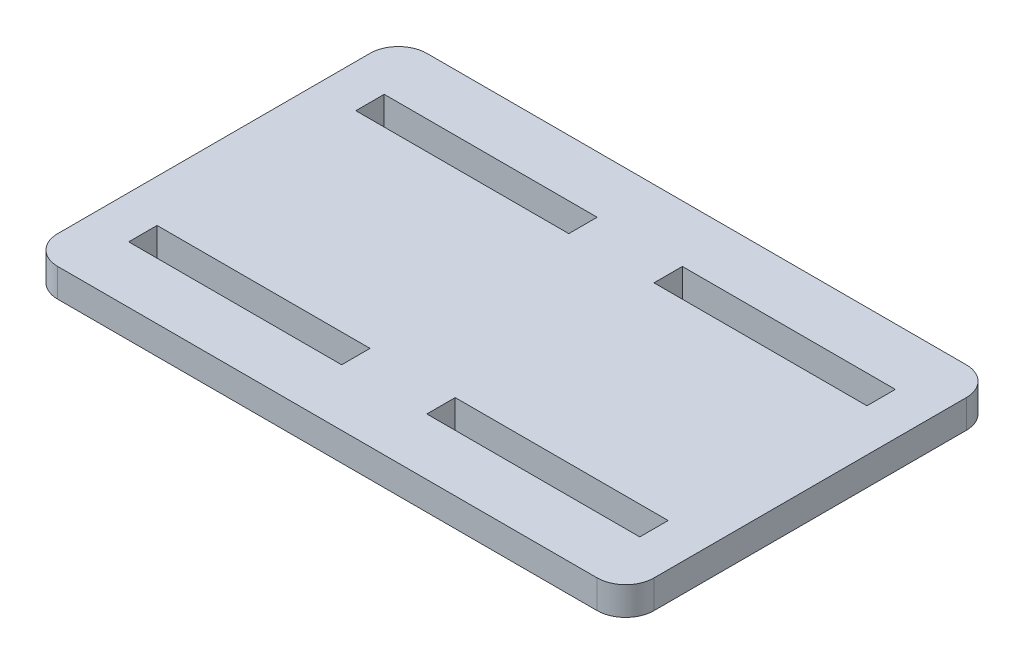
ISO-10303-21;
HEADER;
FILE_DESCRIPTION(('STEP AP214'),'2;1');
FILE_NAME('part.step','',(''),(''),'','','');
FILE_SCHEMA(('AUTOMOTIVE_DESIGN { 1 0 10303 214 1 1 1 1 }'));
ENDSEC;
DATA;
#1=APPLICATION_CONTEXT('core data for automotive mechanical design processes');
#2=APPLICATION_PROTOCOL_DEFINITION('international standard','automotive_design',2000,#1);
#3=PRODUCT_CONTEXT('',#1,'mechanical');
#4=PRODUCT('Part','Part','',(#3));
#5=PRODUCT_RELATED_PRODUCT_CATEGORY('part','',(#4));
#6=PRODUCT_DEFINITION_FORMATION('','',#4);
#7=PRODUCT_DEFINITION_CONTEXT('part definition',#1,'design');
#8=PRODUCT_DEFINITION('design','',#6,#7);
#9=PRODUCT_DEFINITION_SHAPE('','',#8);
#10=(LENGTH_UNIT() NAMED_UNIT(*) SI_UNIT(.MILLI.,.METRE.));
#11=(NAMED_UNIT(*) PLANE_ANGLE_UNIT() SI_UNIT($,.RADIAN.));
#12=(NAMED_UNIT(*) SI_UNIT($,.STERADIAN.) SOLID_ANGLE_UNIT());
#13=UNCERTAINTY_MEASURE_WITH_UNIT(LENGTH_MEASURE(1.E-05),#10,'distance_accuracy_value','');
#14=(GEOMETRIC_REPRESENTATION_CONTEXT(3) GLOBAL_UNCERTAINTY_ASSIGNED_CONTEXT((#13)) GLOBAL_UNIT_ASSIGNED_CONTEXT((#10,
#11,#12)) REPRESENTATION_CONTEXT('',''));
#15=CARTESIAN_POINT('',(0.,0.,0.));
#16=DIRECTION('',(0.,0.,1.));
#17=DIRECTION('',(1.,0.,0.));
#18=AXIS2_PLACEMENT_3D('',#15,#16,#17);
#19=CARTESIAN_POINT('',(11.43,0.,0.));
#20=DIRECTION('',(0.,1.,0.));
#21=DIRECTION('',(0.,0.,1.));
#22=AXIS2_PLACEMENT_3D('',#19,#20,#21);
#23=PLANE('',#22);
#24=DIRECTION('',(1.,0.,0.));
#25=VECTOR('',#24,1.);
#26=CARTESIAN_POINT('',(0.,0.,16.51));
#27=LINE('',#26,#25);
#28=CARTESIAN_POINT('',(-39.37,0.,16.51));
#29=VERTEX_POINT('',#28);
#30=CARTESIAN_POINT('',(8.89,0.,16.51));
#31=VERTEX_POINT('',#30);
#32=EDGE_CURVE('E482',#29,#31,#27,.T.);
#33=ORIENTED_EDGE('',*,*,#32,.F.);
#34=CARTESIAN_POINT('',(-39.37,0.,13.97));
#35=DIRECTION('',(0.,1.,0.));
#36=DIRECTION('',(0.,0.,1.));
#37=AXIS2_PLACEMENT_3D('',#34,#35,#36);
#38=CIRCLE('',#37,2.54);
#39=CARTESIAN_POINT('',(-41.91,0.,13.97));
#40=VERTEX_POINT('',#39);
#41=EDGE_CURVE('E552',#29,#40,#38,.F.);
#42=ORIENTED_EDGE('',*,*,#41,.T.);
#43=DIRECTION('',(0.,0.,-1.));
#44=VECTOR('',#43,1.);
#45=CARTESIAN_POINT('',(-41.91,0.,0.));
#46=LINE('',#45,#44);
#47=CARTESIAN_POINT('',(-41.91,0.,-13.97));
#48=VERTEX_POINT('',#47);
#49=EDGE_CURVE('E500',#40,#48,#46,.T.);
#50=ORIENTED_EDGE('',*,*,#49,.T.);
#51=CARTESIAN_POINT('',(-39.37,0.,-13.97));
#52=DIRECTION('',(0.,1.,0.));
#53=DIRECTION('',(0.,0.,1.));
#54=AXIS2_PLACEMENT_3D('',#51,#52,#53);
#55=CIRCLE('',#54,2.54);
#56=CARTESIAN_POINT('',(-39.37,0.,-16.51));
#57=VERTEX_POINT('',#56);
#58=EDGE_CURVE('E543',#48,#57,#55,.F.);
#59=ORIENTED_EDGE('',*,*,#58,.T.);
#60=DIRECTION('',(1.,0.,0.));
#61=VECTOR('',#60,1.);
#62=CARTESIAN_POINT('',(0.,0.,-16.51));
#63=LINE('',#62,#61);
#64=CARTESIAN_POINT('',(8.89,0.,-16.51));
#65=VERTEX_POINT('',#64);
#66=EDGE_CURVE('E406',#57,#65,#63,.T.);
#67=ORIENTED_EDGE('',*,*,#66,.T.);
#68=CARTESIAN_POINT('',(8.89,0.,-13.97));
#69=DIRECTION('',(0.,1.,0.));
#70=DIRECTION('',(0.,0.,1.));
#71=AXIS2_PLACEMENT_3D('',#68,#69,#70);
#72=CIRCLE('',#71,2.54);
#73=CARTESIAN_POINT('',(11.43,0.,-13.97));
#74=VERTEX_POINT('',#73);
#75=EDGE_CURVE('E546',#65,#74,#72,.F.);
#76=ORIENTED_EDGE('',*,*,#75,.T.);
#77=DIRECTION('',(0.,0.,-1.));
#78=VECTOR('',#77,1.);
#79=CARTESIAN_POINT('',(11.43,0.,0.));
#80=LINE('',#79,#78);
#81=CARTESIAN_POINT('',(11.43,0.,13.97));
#82=VERTEX_POINT('',#81);
#83=EDGE_CURVE('E508',#82,#74,#80,.T.);
#84=ORIENTED_EDGE('',*,*,#83,.F.);
#85=CARTESIAN_POINT('',(8.89,0.,13.97));
#86=DIRECTION('',(0.,1.,0.));
#87=DIRECTION('',(0.,0.,1.));
#88=AXIS2_PLACEMENT_3D('',#85,#86,#87);
#89=CIRCLE('',#88,2.54);
#90=EDGE_CURVE('E549',#82,#31,#89,.F.);
#91=ORIENTED_EDGE('',*,*,#90,.T.);
#92=EDGE_LOOP('',(#33,#42,#50,#59,#67,#76,#84,#91));
#93=FACE_BOUND('',#92,.T.);
#94=DIRECTION('',(0.,0.,-1.));
#95=VECTOR('',#94,1.);
#96=CARTESIAN_POINT('',(-19.05,0.,16.51));
#97=LINE('',#96,#95);
#98=CARTESIAN_POINT('',(-19.05,0.,11.43));
#99=VERTEX_POINT('',#98);
#100=CARTESIAN_POINT('',(-19.05,0.,8.89));
#101=VERTEX_POINT('',#100);
#102=EDGE_CURVE('E496',#99,#101,#97,.T.);
#103=ORIENTED_EDGE('',*,*,#102,.T.);
#104=DIRECTION('',(1.,0.,0.));
#105=VECTOR('',#104,1.);
#106=CARTESIAN_POINT('',(-15.24,0.,8.89));
#107=LINE('',#106,#105);
#108=CARTESIAN_POINT('',(-11.43,0.,8.89));
#109=VERTEX_POINT('',#108);
#110=EDGE_CURVE('E321',#101,#109,#107,.T.);
#111=ORIENTED_EDGE('',*,*,#110,.T.);
#112=DIRECTION('',(0.,0.,-1.));
#113=VECTOR('',#112,1.);
#114=CARTESIAN_POINT('',(-11.43,0.,16.51));
#115=LINE('',#114,#113);
#116=CARTESIAN_POINT('',(-11.43,0.,11.43));
#117=VERTEX_POINT('',#116);
#118=EDGE_CURVE('E448',#117,#109,#115,.T.);
#119=ORIENTED_EDGE('',*,*,#118,.F.);
#120=DIRECTION('',(-1.,0.,0.));
#121=VECTOR('',#120,1.);
#122=CARTESIAN_POINT('',(11.432,0.,11.43));
#123=LINE('',#122,#121);
#124=CARTESIAN_POINT('',(7.62,0.,11.43));
#125=VERTEX_POINT('',#124);
#126=EDGE_CURVE('E423',#125,#117,#123,.T.);
#127=ORIENTED_EDGE('',*,*,#126,.F.);
#128=DIRECTION('',(0.,0.,-1.));
#129=VECTOR('',#128,1.);
#130=CARTESIAN_POINT('',(7.62,0.,16.51));
#131=LINE('',#130,#129);
#132=CARTESIAN_POINT('',(7.62,0.,8.89));
#133=VERTEX_POINT('',#132);
#134=EDGE_CURVE('E438',#125,#133,#131,.T.);
#135=ORIENTED_EDGE('',*,*,#134,.T.);
#136=DIRECTION('',(-1.,0.,0.));
#137=VECTOR('',#136,1.);
#138=CARTESIAN_POINT('',(11.43,0.,8.89));
#139=LINE('',#138,#137);
#140=CARTESIAN_POINT('',(-10.2235,0.,8.89));
#141=VERTEX_POINT('',#140);
#142=EDGE_CURVE('E532',#133,#141,#139,.T.);
#143=ORIENTED_EDGE('',*,*,#142,.T.);
#144=DIRECTION('',(0.,0.,-1.));
#145=VECTOR('',#144,1.);
#146=CARTESIAN_POINT('',(-10.2235,0.,8.89));
#147=LINE('',#146,#145);
#148=CARTESIAN_POINT('',(-10.2235,0.,-8.89));
#149=VERTEX_POINT('',#148);
#150=EDGE_CURVE('E331',#141,#149,#147,.T.);
#151=ORIENTED_EDGE('',*,*,#150,.T.);
#152=DIRECTION('',(-1.,0.,0.));
#153=VECTOR('',#152,1.);
#154=CARTESIAN_POINT('',(11.43,0.,-8.89));
#155=LINE('',#154,#153);
#156=CARTESIAN_POINT('',(7.62,0.,-8.89));
#157=VERTEX_POINT('',#156);
#158=EDGE_CURVE('E527',#157,#149,#155,.T.);
#159=ORIENTED_EDGE('',*,*,#158,.F.);
#160=DIRECTION('',(0.,0.,1.));
#161=VECTOR('',#160,1.);
#162=CARTESIAN_POINT('',(7.62,0.,-16.51));
#163=LINE('',#162,#161);
#164=CARTESIAN_POINT('',(7.62,0.,-11.43));
#165=VERTEX_POINT('',#164);
#166=EDGE_CURVE('E362',#165,#157,#163,.T.);
#167=ORIENTED_EDGE('',*,*,#166,.F.);
#168=DIRECTION('',(-1.,0.,0.));
#169=VECTOR('',#168,1.);
#170=CARTESIAN_POINT('',(11.432,0.,-11.43));
#171=LINE('',#170,#169);
#172=CARTESIAN_POINT('',(-11.43,0.,-11.43));
#173=VERTEX_POINT('',#172);
#174=EDGE_CURVE('E352',#165,#173,#171,.T.);
#175=ORIENTED_EDGE('',*,*,#174,.T.);
#176=DIRECTION('',(0.,0.,1.));
#177=VECTOR('',#176,1.);
#178=CARTESIAN_POINT('',(-11.43,0.,-16.51));
#179=LINE('',#178,#177);
#180=CARTESIAN_POINT('',(-11.43,0.,-8.89));
#181=VERTEX_POINT('',#180);
#182=EDGE_CURVE('E374',#173,#181,#179,.T.);
#183=ORIENTED_EDGE('',*,*,#182,.T.);
#184=DIRECTION('',(1.,0.,0.));
#185=VECTOR('',#184,1.);
#186=CARTESIAN_POINT('',(-15.24,0.,-8.89));
#187=LINE('',#186,#185);
#188=CARTESIAN_POINT('',(-19.05,0.,-8.89));
#189=VERTEX_POINT('',#188);
#190=EDGE_CURVE('E326',#189,#181,#187,.T.);
#191=ORIENTED_EDGE('',*,*,#190,.F.);
#192=DIRECTION('',(0.,0.,1.));
#193=VECTOR('',#192,1.);
#194=CARTESIAN_POINT('',(-19.05,0.,-16.51));
#195=LINE('',#194,#193);
#196=CARTESIAN_POINT('',(-19.05,0.,-11.43));
#197=VERTEX_POINT('',#196);
#198=EDGE_CURVE('E410',#197,#189,#195,.T.);
#199=ORIENTED_EDGE('',*,*,#198,.F.);
#200=DIRECTION('',(1.,0.,0.));
#201=VECTOR('',#200,1.);
#202=CARTESIAN_POINT('',(-41.912,0.,-11.43));
#203=LINE('',#202,#201);
#204=CARTESIAN_POINT('',(-38.1,0.,-11.43));
#205=VERTEX_POINT('',#204);
#206=EDGE_CURVE('E380',#205,#197,#203,.T.);
#207=ORIENTED_EDGE('',*,*,#206,.F.);
#208=DIRECTION('',(0.,0.,1.));
#209=VECTOR('',#208,1.);
#210=CARTESIAN_POINT('',(-38.1,0.,-16.51));
#211=LINE('',#210,#209);
#212=CARTESIAN_POINT('',(-38.1,0.,-8.89));
#213=VERTEX_POINT('',#212);
#214=EDGE_CURVE('E394',#205,#213,#211,.T.);
#215=ORIENTED_EDGE('',*,*,#214,.T.);
#216=CARTESIAN_POINT('',(-20.2565,0.,-8.89));
#217=VERTEX_POINT('',#216);
#218=EDGE_CURVE('E526',#217,#213,#155,.T.);
#219=ORIENTED_EDGE('',*,*,#218,.F.);
#220=DIRECTION('',(0.,0.,-1.));
#221=VECTOR('',#220,1.);
#222=CARTESIAN_POINT('',(-20.2565,0.,8.89));
#223=LINE('',#222,#221);
#224=CARTESIAN_POINT('',(-20.2565,0.,8.89));
#225=VERTEX_POINT('',#224);
#226=EDGE_CURVE('E262',#225,#217,#223,.T.);
#227=ORIENTED_EDGE('',*,*,#226,.F.);
#228=CARTESIAN_POINT('',(-38.1,0.,8.89));
#229=VERTEX_POINT('',#228);
#230=EDGE_CURVE('E531',#225,#229,#139,.T.);
#231=ORIENTED_EDGE('',*,*,#230,.T.);
#232=DIRECTION('',(0.,0.,-1.));
#233=VECTOR('',#232,1.);
#234=CARTESIAN_POINT('',(-38.1,0.,16.51));
#235=LINE('',#234,#233);
#236=CARTESIAN_POINT('',(-38.1,0.,11.43));
#237=VERTEX_POINT('',#236);
#238=EDGE_CURVE('E471',#237,#229,#235,.T.);
#239=ORIENTED_EDGE('',*,*,#238,.F.);
#240=DIRECTION('',(1.,0.,0.));
#241=VECTOR('',#240,1.);
#242=CARTESIAN_POINT('',(-41.912,0.,11.43));
#243=LINE('',#242,#241);
#244=EDGE_CURVE('E459',#237,#99,#243,.T.);
#245=ORIENTED_EDGE('',*,*,#244,.T.);
#246=EDGE_LOOP('',(#103,#111,#119,#127,#135,#143,#151,#159,#167,#175,#183,#191,#199,#207,#215,
#219,#227,#231,#239,#245));
#247=FACE_BOUND('',#246,.T.);
#248=ADVANCED_FACE('F41',(#93,#247),#23,.F.);
#249=CARTESIAN_POINT('',(-10.2235,-5.0165,8.89));
#250=DIRECTION('',(1.,0.,0.));
#251=DIRECTION('',(0.,0.,-1.));
#252=AXIS2_PLACEMENT_3D('',#249,#250,#251);
#253=PLANE('',#252);
#254=DIRECTION('',(0.,1.,0.));
#255=VECTOR('',#254,1.);
#256=CARTESIAN_POINT('',(-10.2235,-5.0165,8.89));
#257=LINE('',#256,#255);
#258=CARTESIAN_POINT('',(-10.2235,-2.54,8.89));
#259=VERTEX_POINT('',#258);
#260=EDGE_CURVE('E62',#259,#141,#257,.T.);
#261=ORIENTED_EDGE('',*,*,#260,.F.);
#262=DIRECTION('',(0.,0.,1.));
#263=VECTOR('',#262,1.);
#264=CARTESIAN_POINT('',(-10.2235,-2.54,8.89));
#265=LINE('',#264,#263);
#266=CARTESIAN_POINT('',(-10.2235,-2.54,-8.89));
#267=VERTEX_POINT('',#266);
#268=EDGE_CURVE('E57',#267,#259,#265,.T.);
#269=ORIENTED_EDGE('',*,*,#268,.F.);
#270=DIRECTION('',(0.,1.,0.));
#271=VECTOR('',#270,1.);
#272=CARTESIAN_POINT('',(-10.2235,-5.0165,-8.89));
#273=LINE('',#272,#271);
#274=EDGE_CURVE('E338',#267,#149,#273,.T.);
#275=ORIENTED_EDGE('',*,*,#274,.T.);
#276=ORIENTED_EDGE('',*,*,#150,.F.);
#277=EDGE_LOOP('',(#261,#269,#275,#276));
#278=FACE_BOUND('',#277,.T.);
#279=ADVANCED_FACE('F629',(#278),#253,.T.);
#280=CARTESIAN_POINT('',(-11.43,0.,-16.51));
#281=DIRECTION('',(1.,0.,0.));
#282=DIRECTION('',(0.,0.,-1.));
#283=AXIS2_PLACEMENT_3D('',#280,#281,#282);
#284=PLANE('',#283);
#285=ORIENTED_EDGE('',*,*,#182,.F.);
#286=DIRECTION('',(0.,-1.,0.));
#287=VECTOR('',#286,1.);
#288=CARTESIAN_POINT('',(-11.43,0.,-11.43));
#289=LINE('',#288,#287);
#290=CARTESIAN_POINT('',(-11.43,2.54,-11.43));
#291=VERTEX_POINT('',#290);
#292=EDGE_CURVE('E348',#291,#173,#289,.T.);
#293=ORIENTED_EDGE('',*,*,#292,.F.);
#294=DIRECTION('',(0.,0.,1.));
#295=VECTOR('',#294,1.);
#296=CARTESIAN_POINT('',(-11.43,2.54,-16.51));
#297=LINE('',#296,#295);
#298=CARTESIAN_POINT('',(-11.43,2.54,-8.89));
#299=VERTEX_POINT('',#298);
#300=EDGE_CURVE('E371',#291,#299,#297,.T.);
#301=ORIENTED_EDGE('',*,*,#300,.T.);
#302=DIRECTION('',(0.,1.,0.));
#303=VECTOR('',#302,1.);
#304=CARTESIAN_POINT('',(-11.43,0.,-8.89));
#305=LINE('',#304,#303);
#306=EDGE_CURVE('E365',#181,#299,#305,.T.);
#307=ORIENTED_EDGE('',*,*,#306,.F.);
#308=EDGE_LOOP('',(#285,#293,#301,#307));
#309=FACE_BOUND('',#308,.T.);
#310=ADVANCED_FACE('F634',(#309),#284,.T.);
#311=CARTESIAN_POINT('',(7.62,2.54,-16.51));
#312=DIRECTION('',(-1.,0.,0.));
#313=DIRECTION('',(0.,0.,1.));
#314=AXIS2_PLACEMENT_3D('',#311,#312,#313);
#315=PLANE('',#314);
#316=DIRECTION('',(0.,0.,1.));
#317=VECTOR('',#316,1.);
#318=CARTESIAN_POINT('',(7.62,2.54,-16.51));
#319=LINE('',#318,#317);
#320=CARTESIAN_POINT('',(7.62,2.54,-11.43));
#321=VERTEX_POINT('',#320);
#322=CARTESIAN_POINT('',(7.62,2.54,-8.89));
#323=VERTEX_POINT('',#322);
#324=EDGE_CURVE('E361',#321,#323,#319,.T.);
#325=ORIENTED_EDGE('',*,*,#324,.F.);
#326=DIRECTION('',(0.,1.,0.));
#327=VECTOR('',#326,1.);
#328=CARTESIAN_POINT('',(7.62,0.,-11.43));
#329=LINE('',#328,#327);
#330=EDGE_CURVE('E341',#165,#321,#329,.T.);
#331=ORIENTED_EDGE('',*,*,#330,.F.);
#332=ORIENTED_EDGE('',*,*,#166,.T.);
#333=DIRECTION('',(0.,-1.,0.));
#334=VECTOR('',#333,1.);
#335=CARTESIAN_POINT('',(7.62,2.54,-8.89));
#336=LINE('',#335,#334);
#337=EDGE_CURVE('E351',#323,#157,#336,.T.);
#338=ORIENTED_EDGE('',*,*,#337,.F.);
#339=EDGE_LOOP('',(#325,#331,#332,#338));
#340=FACE_BOUND('',#339,.T.);
#341=ADVANCED_FACE('F660',(#340),#315,.T.);
#342=CARTESIAN_POINT('',(-19.05,0.,16.51));
#343=DIRECTION('',(-1.,0.,0.));
#344=DIRECTION('',(0.,0.,1.));
#345=AXIS2_PLACEMENT_3D('',#342,#343,#344);
#346=PLANE('',#345);
#347=ORIENTED_EDGE('',*,*,#102,.F.);
#348=DIRECTION('',(0.,-1.,0.));
#349=VECTOR('',#348,1.);
#350=CARTESIAN_POINT('',(-19.05,0.,11.43));
#351=LINE('',#350,#349);
#352=CARTESIAN_POINT('',(-19.05,2.54,11.43));
#353=VERTEX_POINT('',#352);
#354=EDGE_CURVE('E455',#353,#99,#351,.T.);
#355=ORIENTED_EDGE('',*,*,#354,.F.);
#356=DIRECTION('',(0.,0.,-1.));
#357=VECTOR('',#356,1.);
#358=CARTESIAN_POINT('',(-19.05,2.54,16.51));
#359=LINE('',#358,#357);
#360=CARTESIAN_POINT('',(-19.05,2.54,8.89));
#361=VERTEX_POINT('',#360);
#362=EDGE_CURVE('E490',#353,#361,#359,.T.);
#363=ORIENTED_EDGE('',*,*,#362,.T.);
#364=DIRECTION('',(0.,1.,0.));
#365=VECTOR('',#364,1.);
#366=CARTESIAN_POINT('',(-19.05,0.,8.89));
#367=LINE('',#366,#365);
#368=EDGE_CURVE('E481',#101,#361,#367,.T.);
#369=ORIENTED_EDGE('',*,*,#368,.F.);
#370=EDGE_LOOP('',(#347,#355,#363,#369));
#371=FACE_BOUND('',#370,.T.);
#372=ADVANCED_FACE('F663',(#371),#346,.T.);
#373=CARTESIAN_POINT('',(-38.1,2.54,16.51));
#374=DIRECTION('',(1.,0.,0.));
#375=DIRECTION('',(0.,0.,-1.));
#376=AXIS2_PLACEMENT_3D('',#373,#374,#375);
#377=PLANE('',#376);
#378=DIRECTION('',(0.,0.,-1.));
#379=VECTOR('',#378,1.);
#380=CARTESIAN_POINT('',(-38.1,2.54,16.51));
#381=LINE('',#380,#379);
#382=CARTESIAN_POINT('',(-38.1,2.54,11.43));
#383=VERTEX_POINT('',#382);
#384=CARTESIAN_POINT('',(-38.1,2.54,8.89));
#385=VERTEX_POINT('',#384);
#386=EDGE_CURVE('E472',#383,#385,#381,.T.);
#387=ORIENTED_EDGE('',*,*,#386,.F.);
#388=DIRECTION('',(0.,1.,0.));
#389=VECTOR('',#388,1.);
#390=CARTESIAN_POINT('',(-38.1,0.,11.43));
#391=LINE('',#390,#389);
#392=EDGE_CURVE('E464',#237,#383,#391,.T.);
#393=ORIENTED_EDGE('',*,*,#392,.F.);
#394=ORIENTED_EDGE('',*,*,#238,.T.);
#395=DIRECTION('',(0.,-1.,0.));
#396=VECTOR('',#395,1.);
#397=CARTESIAN_POINT('',(-38.1,2.54,8.89));
#398=LINE('',#397,#396);
#399=EDGE_CURVE('E475',#385,#229,#398,.T.);
#400=ORIENTED_EDGE('',*,*,#399,.F.);
#401=EDGE_LOOP('',(#387,#393,#394,#400));
#402=FACE_BOUND('',#401,.T.);
#403=ADVANCED_FACE('F642',(#402),#377,.T.);
#404=CARTESIAN_POINT('',(11.43,0.,8.89));
#405=DIRECTION('',(0.,0.,1.));
#406=DIRECTION('',(1.,0.,0.));
#407=AXIS2_PLACEMENT_3D('',#404,#405,#406);
#408=PLANE('',#407);
#409=ORIENTED_EDGE('',*,*,#399,.T.);
#410=ORIENTED_EDGE('',*,*,#230,.F.);
#411=DIRECTION('',(0.,1.,0.));
#412=VECTOR('',#411,1.);
#413=CARTESIAN_POINT('',(-20.2565,-5.0165,8.89));
#414=LINE('',#413,#412);
#415=CARTESIAN_POINT('',(-20.2565,-2.54,8.89));
#416=VERTEX_POINT('',#415);
#417=EDGE_CURVE('E256',#416,#225,#414,.T.);
#418=ORIENTED_EDGE('',*,*,#417,.F.);
#419=DIRECTION('',(1.,0.,0.));
#420=VECTOR('',#419,1.);
#421=CARTESIAN_POINT('',(-25.273,-2.54,8.89));
#422=LINE('',#421,#420);
#423=CARTESIAN_POINT('',(-25.273,-2.54,8.89));
#424=VERTEX_POINT('',#423);
#425=EDGE_CURVE('E249',#424,#416,#422,.T.);
#426=ORIENTED_EDGE('',*,*,#425,.F.);
#427=DIRECTION('',(0.,-1.,0.));
#428=VECTOR('',#427,1.);
#429=CARTESIAN_POINT('',(-25.273,-5.0165,8.89));
#430=LINE('',#429,#428);
#431=CARTESIAN_POINT('',(-25.273,-5.0165,8.89));
#432=VERTEX_POINT('',#431);
#433=EDGE_CURVE('E253',#424,#432,#430,.T.);
#434=ORIENTED_EDGE('',*,*,#433,.T.);
#435=DIRECTION('',(1.,0.,0.));
#436=VECTOR('',#435,1.);
#437=CARTESIAN_POINT('',(-15.24,-5.0165,8.89));
#438=LINE('',#437,#436);
#439=CARTESIAN_POINT('',(-5.207,-5.0165,8.89));
#440=VERTEX_POINT('',#439);
#441=EDGE_CURVE('E322',#432,#440,#438,.T.);
#442=ORIENTED_EDGE('',*,*,#441,.T.);
#443=DIRECTION('',(0.,-1.,0.));
#444=VECTOR('',#443,1.);
#445=CARTESIAN_POINT('',(-5.207,-5.0165,8.89));
#446=LINE('',#445,#444);
#447=CARTESIAN_POINT('',(-5.207,-2.54,8.89));
#448=VERTEX_POINT('',#447);
#449=EDGE_CURVE('E297',#448,#440,#446,.T.);
#450=ORIENTED_EDGE('',*,*,#449,.F.);
#451=DIRECTION('',(-1.,0.,0.));
#452=VECTOR('',#451,1.);
#453=CARTESIAN_POINT('',(-5.207,-2.54,8.89));
#454=LINE('',#453,#452);
#455=EDGE_CURVE('E311',#448,#259,#454,.T.);
#456=ORIENTED_EDGE('',*,*,#455,.T.);
#457=ORIENTED_EDGE('',*,*,#260,.T.);
#458=ORIENTED_EDGE('',*,*,#142,.F.);
#459=DIRECTION('',(0.,-1.,0.));
#460=VECTOR('',#459,1.);
#461=CARTESIAN_POINT('',(7.62,2.54,8.89));
#462=LINE('',#461,#460);
#463=CARTESIAN_POINT('',(7.62,2.54,8.89));
#464=VERTEX_POINT('',#463);
#465=EDGE_CURVE('E428',#464,#133,#462,.T.);
#466=ORIENTED_EDGE('',*,*,#465,.F.);
#467=DIRECTION('',(-1.,0.,0.));
#468=VECTOR('',#467,1.);
#469=CARTESIAN_POINT('',(11.43,2.54,8.89));
#470=LINE('',#469,#468);
#471=CARTESIAN_POINT('',(-11.43,2.54,8.89));
#472=VERTEX_POINT('',#471);
#473=EDGE_CURVE('E517',#464,#472,#470,.T.);
#474=ORIENTED_EDGE('',*,*,#473,.T.);
#475=DIRECTION('',(0.,1.,0.));
#476=VECTOR('',#475,1.);
#477=CARTESIAN_POINT('',(-11.43,0.,8.89));
#478=LINE('',#477,#476);
#479=EDGE_CURVE('E442',#109,#472,#478,.T.);
#480=ORIENTED_EDGE('',*,*,#479,.F.);
#481=ORIENTED_EDGE('',*,*,#110,.F.);
#482=ORIENTED_EDGE('',*,*,#368,.T.);
#483=EDGE_CURVE('E516',#361,#385,#470,.T.);
#484=ORIENTED_EDGE('',*,*,#483,.T.);
#485=EDGE_LOOP('',(#409,#410,#418,#426,#434,#442,#450,#456,#457,#458,#466,#474,#480,#481,#482,#484));
#486=FACE_BOUND('',#485,.T.);
#487=ADVANCED_FACE('F252',(#486),#408,.T.);
#488=CARTESIAN_POINT('',(11.43,0.,-8.89));
#489=DIRECTION('',(0.,0.,1.));
#490=DIRECTION('',(1.,0.,0.));
#491=AXIS2_PLACEMENT_3D('',#488,#489,#490);
#492=PLANE('',#491);
#493=DIRECTION('',(-1.,0.,0.));
#494=VECTOR('',#493,1.);
#495=CARTESIAN_POINT('',(11.43,2.54,-8.89));
#496=LINE('',#495,#494);
#497=EDGE_CURVE('E522',#323,#299,#496,.T.);
#498=ORIENTED_EDGE('',*,*,#497,.F.);
#499=ORIENTED_EDGE('',*,*,#337,.T.);
#500=ORIENTED_EDGE('',*,*,#158,.T.);
#501=ORIENTED_EDGE('',*,*,#274,.F.);
#502=DIRECTION('',(-1.,0.,0.));
#503=VECTOR('',#502,1.);
#504=CARTESIAN_POINT('',(-5.207,-2.54,-8.89));
#505=LINE('',#504,#503);
#506=CARTESIAN_POINT('',(-5.207,-2.54,-8.89));
#507=VERTEX_POINT('',#506);
#508=EDGE_CURVE('E317',#507,#267,#505,.T.);
#509=ORIENTED_EDGE('',*,*,#508,.F.);
#510=DIRECTION('',(0.,1.,0.));
#511=VECTOR('',#510,1.);
#512=CARTESIAN_POINT('',(-5.207,-5.0165,-8.89));
#513=LINE('',#512,#511);
#514=CARTESIAN_POINT('',(-5.207,-5.0165,-8.89));
#515=VERTEX_POINT('',#514);
#516=EDGE_CURVE('E305',#515,#507,#513,.T.);
#517=ORIENTED_EDGE('',*,*,#516,.F.);
#518=DIRECTION('',(1.,0.,0.));
#519=VECTOR('',#518,1.);
#520=CARTESIAN_POINT('',(-15.24,-5.0165,-8.89));
#521=LINE('',#520,#519);
#522=CARTESIAN_POINT('',(-25.273,-5.0165,-8.89));
#523=VERTEX_POINT('',#522);
#524=EDGE_CURVE('E325',#523,#515,#521,.T.);
#525=ORIENTED_EDGE('',*,*,#524,.F.);
#526=DIRECTION('',(0.,1.,0.));
#527=VECTOR('',#526,1.);
#528=CARTESIAN_POINT('',(-25.273,-5.0165,-8.89));
#529=LINE('',#528,#527);
#530=CARTESIAN_POINT('',(-25.273,-2.54,-8.89));
#531=VERTEX_POINT('',#530);
#532=EDGE_CURVE('E278',#523,#531,#529,.T.);
#533=ORIENTED_EDGE('',*,*,#532,.T.);
#534=DIRECTION('',(1.,0.,0.));
#535=VECTOR('',#534,1.);
#536=CARTESIAN_POINT('',(-25.273,-2.54,-8.89));
#537=LINE('',#536,#535);
#538=CARTESIAN_POINT('',(-20.2565,-2.54,-8.89));
#539=VERTEX_POINT('',#538);
#540=EDGE_CURVE('E263',#531,#539,#537,.T.);
#541=ORIENTED_EDGE('',*,*,#540,.T.);
#542=DIRECTION('',(0.,1.,0.));
#543=VECTOR('',#542,1.);
#544=CARTESIAN_POINT('',(-20.2565,-5.0165,-8.89));
#545=LINE('',#544,#543);
#546=EDGE_CURVE('E292',#539,#217,#545,.T.);
#547=ORIENTED_EDGE('',*,*,#546,.T.);
#548=ORIENTED_EDGE('',*,*,#218,.T.);
#549=DIRECTION('',(0.,-1.,0.));
#550=VECTOR('',#549,1.);
#551=CARTESIAN_POINT('',(-38.1,2.54,-8.89));
#552=LINE('',#551,#550);
#553=CARTESIAN_POINT('',(-38.1,2.54,-8.89));
#554=VERTEX_POINT('',#553);
#555=EDGE_CURVE('E385',#554,#213,#552,.T.);
#556=ORIENTED_EDGE('',*,*,#555,.F.);
#557=CARTESIAN_POINT('',(-19.05,2.54,-8.89));
#558=VERTEX_POINT('',#557);
#559=EDGE_CURVE('E521',#558,#554,#496,.T.);
#560=ORIENTED_EDGE('',*,*,#559,.F.);
#561=DIRECTION('',(0.,1.,0.));
#562=VECTOR('',#561,1.);
#563=CARTESIAN_POINT('',(-19.05,0.,-8.89));
#564=LINE('',#563,#562);
#565=EDGE_CURVE('E398',#189,#558,#564,.T.);
#566=ORIENTED_EDGE('',*,*,#565,.F.);
#567=ORIENTED_EDGE('',*,*,#190,.T.);
#568=ORIENTED_EDGE('',*,*,#306,.T.);
#569=EDGE_LOOP('',(#498,#499,#500,#501,#509,#517,#525,#533,#541,#547,#548,#556,#560,#566,#567,#568));
#570=FACE_BOUND('',#569,.T.);
#571=ADVANCED_FACE('F638',(#570),#492,.F.);
#572=CARTESIAN_POINT('',(11.43,2.54,0.));
#573=DIRECTION('',(0.,1.,0.));
#574=DIRECTION('',(0.,0.,1.));
#575=AXIS2_PLACEMENT_3D('',#572,#573,#574);
#576=PLANE('',#575);
#577=ORIENTED_EDGE('',*,*,#300,.F.);
#578=DIRECTION('',(-1.,0.,0.));
#579=VECTOR('',#578,1.);
#580=CARTESIAN_POINT('',(11.432,2.54,-11.43));
#581=LINE('',#580,#579);
#582=EDGE_CURVE('E347',#321,#291,#581,.T.);
#583=ORIENTED_EDGE('',*,*,#582,.F.);
#584=ORIENTED_EDGE('',*,*,#324,.T.);
#585=ORIENTED_EDGE('',*,*,#497,.T.);
#586=EDGE_LOOP('',(#577,#583,#584,#585));
#587=FACE_BOUND('',#586,.T.);
#588=DIRECTION('',(0.,0.,-1.));
#589=VECTOR('',#588,1.);
#590=CARTESIAN_POINT('',(-41.91,2.54,0.));
#591=LINE('',#590,#589);
#592=CARTESIAN_POINT('',(-41.91,2.54,13.97));
#593=VERTEX_POINT('',#592);
#594=CARTESIAN_POINT('',(-41.91,2.54,-13.97));
#595=VERTEX_POINT('',#594);
#596=EDGE_CURVE('E504',#593,#595,#591,.T.);
#597=ORIENTED_EDGE('',*,*,#596,.F.);
#598=CARTESIAN_POINT('',(-39.37,2.54,13.97));
#599=DIRECTION('',(0.,1.,0.));
#600=DIRECTION('',(0.,0.,1.));
#601=AXIS2_PLACEMENT_3D('',#598,#599,#600);
#602=CIRCLE('',#601,2.54);
#603=CARTESIAN_POINT('',(-39.37,2.54,16.51));
#604=VERTEX_POINT('',#603);
#605=EDGE_CURVE('E571',#593,#604,#602,.T.);
#606=ORIENTED_EDGE('',*,*,#605,.T.);
#607=DIRECTION('',(-1.,0.,0.));
#608=VECTOR('',#607,1.);
#609=CARTESIAN_POINT('',(0.,2.54,16.51));
#610=LINE('',#609,#608);
#611=CARTESIAN_POINT('',(8.89,2.54,16.51));
#612=VERTEX_POINT('',#611);
#613=EDGE_CURVE('E486',#612,#604,#610,.T.);
#614=ORIENTED_EDGE('',*,*,#613,.F.);
#615=CARTESIAN_POINT('',(8.89,2.54,13.97));
#616=DIRECTION('',(0.,1.,0.));
#617=DIRECTION('',(0.,0.,1.));
#618=AXIS2_PLACEMENT_3D('',#615,#616,#617);
#619=CIRCLE('',#618,2.54);
#620=CARTESIAN_POINT('',(11.43,2.54,13.97));
#621=VERTEX_POINT('',#620);
#622=EDGE_CURVE('E568',#612,#621,#619,.T.);
#623=ORIENTED_EDGE('',*,*,#622,.T.);
#624=DIRECTION('',(0.,0.,-1.));
#625=VECTOR('',#624,1.);
#626=CARTESIAN_POINT('',(11.43,2.54,0.));
#627=LINE('',#626,#625);
#628=CARTESIAN_POINT('',(11.43,2.54,-13.97));
#629=VERTEX_POINT('',#628);
#630=EDGE_CURVE('E512',#621,#629,#627,.T.);
#631=ORIENTED_EDGE('',*,*,#630,.T.);
#632=CARTESIAN_POINT('',(8.89,2.54,-13.97));
#633=DIRECTION('',(0.,1.,0.));
#634=DIRECTION('',(0.,0.,1.));
#635=AXIS2_PLACEMENT_3D('',#632,#633,#634);
#636=CIRCLE('',#635,2.54);
#637=CARTESIAN_POINT('',(8.89,2.54,-16.51));
#638=VERTEX_POINT('',#637);
#639=EDGE_CURVE('E565',#629,#638,#636,.T.);
#640=ORIENTED_EDGE('',*,*,#639,.T.);
#641=DIRECTION('',(-1.,0.,0.));
#642=VECTOR('',#641,1.);
#643=CARTESIAN_POINT('',(0.,2.54,-16.51));
#644=LINE('',#643,#642);
#645=CARTESIAN_POINT('',(-39.37,2.54,-16.51));
#646=VERTEX_POINT('',#645);
#647=EDGE_CURVE('E402',#638,#646,#644,.T.);
#648=ORIENTED_EDGE('',*,*,#647,.T.);
#649=CARTESIAN_POINT('',(-39.37,2.54,-13.97));
#650=DIRECTION('',(0.,1.,0.));
#651=DIRECTION('',(0.,0.,1.));
#652=AXIS2_PLACEMENT_3D('',#649,#650,#651);
#653=CIRCLE('',#652,2.54);
#654=EDGE_CURVE('E562',#646,#595,#653,.T.);
#655=ORIENTED_EDGE('',*,*,#654,.T.);
#656=EDGE_LOOP('',(#597,#606,#614,#623,#631,#640,#648,#655));
#657=FACE_BOUND('',#656,.T.);
#658=DIRECTION('',(1.,0.,0.));
#659=VECTOR('',#658,1.);
#660=CARTESIAN_POINT('',(-41.912,2.54,-11.43));
#661=LINE('',#660,#659);
#662=CARTESIAN_POINT('',(-38.1,2.54,-11.43));
#663=VERTEX_POINT('',#662);
#664=CARTESIAN_POINT('',(-19.05,2.54,-11.43));
#665=VERTEX_POINT('',#664);
#666=EDGE_CURVE('E386',#663,#665,#661,.T.);
#667=ORIENTED_EDGE('',*,*,#666,.T.);
#668=DIRECTION('',(0.,0.,1.));
#669=VECTOR('',#668,1.);
#670=CARTESIAN_POINT('',(-19.05,2.54,-16.51));
#671=LINE('',#670,#669);
#672=EDGE_CURVE('E417',#665,#558,#671,.T.);
#673=ORIENTED_EDGE('',*,*,#672,.T.);
#674=ORIENTED_EDGE('',*,*,#559,.T.);
#675=DIRECTION('',(0.,0.,1.));
#676=VECTOR('',#675,1.);
#677=CARTESIAN_POINT('',(-38.1,2.54,-16.51));
#678=LINE('',#677,#676);
#679=EDGE_CURVE('E395',#663,#554,#678,.T.);
#680=ORIENTED_EDGE('',*,*,#679,.F.);
#681=EDGE_LOOP('',(#667,#673,#674,#680));
#682=FACE_BOUND('',#681,.T.);
#683=DIRECTION('',(-1.,0.,0.));
#684=VECTOR('',#683,1.);
#685=CARTESIAN_POINT('',(11.432,2.54,11.43));
#686=LINE('',#685,#684);
#687=CARTESIAN_POINT('',(7.62,2.54,11.43));
#688=VERTEX_POINT('',#687);
#689=CARTESIAN_POINT('',(-11.43,2.54,11.43));
#690=VERTEX_POINT('',#689);
#691=EDGE_CURVE('E429',#688,#690,#686,.T.);
#692=ORIENTED_EDGE('',*,*,#691,.T.);
#693=DIRECTION('',(0.,0.,-1.));
#694=VECTOR('',#693,1.);
#695=CARTESIAN_POINT('',(-11.43,2.54,16.51));
#696=LINE('',#695,#694);
#697=EDGE_CURVE('E452',#690,#472,#696,.T.);
#698=ORIENTED_EDGE('',*,*,#697,.T.);
#699=ORIENTED_EDGE('',*,*,#473,.F.);
#700=DIRECTION('',(0.,0.,-1.));
#701=VECTOR('',#700,1.);
#702=CARTESIAN_POINT('',(7.62,2.54,16.51));
#703=LINE('',#702,#701);
#704=EDGE_CURVE('E439',#688,#464,#703,.T.);
#705=ORIENTED_EDGE('',*,*,#704,.F.);
#706=EDGE_LOOP('',(#692,#698,#699,#705));
#707=FACE_BOUND('',#706,.T.);
#708=ORIENTED_EDGE('',*,*,#362,.F.);
#709=DIRECTION('',(1.,0.,0.));
#710=VECTOR('',#709,1.);
#711=CARTESIAN_POINT('',(-41.912,2.54,11.43));
#712=LINE('',#711,#710);
#713=EDGE_CURVE('E460',#383,#353,#712,.T.);
#714=ORIENTED_EDGE('',*,*,#713,.F.);
#715=ORIENTED_EDGE('',*,*,#386,.T.);
#716=ORIENTED_EDGE('',*,*,#483,.F.);
#717=EDGE_LOOP('',(#708,#714,#715,#716));
#718=FACE_BOUND('',#717,.T.);
#719=ADVANCED_FACE('F591',(#587,#657,#682,#707,#718),#576,.T.);
#720=CARTESIAN_POINT('',(11.43,0.,0.));
#721=DIRECTION('',(1.,0.,0.));
#722=DIRECTION('',(0.,0.,-1.));
#723=AXIS2_PLACEMENT_3D('',#720,#721,#722);
#724=PLANE('',#723);
#725=ORIENTED_EDGE('',*,*,#630,.F.);
#726=DIRECTION('',(0.,-1.,0.));
#727=VECTOR('',#726,1.);
#728=CARTESIAN_POINT('',(11.43,0.,13.97));
#729=LINE('',#728,#727);
#730=EDGE_CURVE('E577',#621,#82,#729,.T.);
#731=ORIENTED_EDGE('',*,*,#730,.T.);
#732=ORIENTED_EDGE('',*,*,#83,.T.);
#733=DIRECTION('',(0.,-1.,0.));
#734=VECTOR('',#733,1.);
#735=CARTESIAN_POINT('',(11.43,0.,-13.97));
#736=LINE('',#735,#734);
#737=EDGE_CURVE('E574',#74,#629,#736,.F.);
#738=ORIENTED_EDGE('',*,*,#737,.T.);
#739=EDGE_LOOP('',(#725,#731,#732,#738));
#740=FACE_BOUND('',#739,.T.);
#741=ADVANCED_FACE('F617',(#740),#724,.T.);
#742=CARTESIAN_POINT('',(-41.91,0.,0.));
#743=DIRECTION('',(-1.,0.,0.));
#744=DIRECTION('',(0.,0.,-1.));
#745=AXIS2_PLACEMENT_3D('',#742,#743,#744);
#746=PLANE('',#745);
#747=ORIENTED_EDGE('',*,*,#49,.F.);
#748=DIRECTION('',(0.,-1.,0.));
#749=VECTOR('',#748,1.);
#750=CARTESIAN_POINT('',(-41.91,0.,13.97));
#751=LINE('',#750,#749);
#752=EDGE_CURVE('E559',#40,#593,#751,.F.);
#753=ORIENTED_EDGE('',*,*,#752,.T.);
#754=ORIENTED_EDGE('',*,*,#596,.T.);
#755=DIRECTION('',(0.,-1.,0.));
#756=VECTOR('',#755,1.);
#757=CARTESIAN_POINT('',(-41.91,0.,-13.97));
#758=LINE('',#757,#756);
#759=EDGE_CURVE('E555',#595,#48,#758,.T.);
#760=ORIENTED_EDGE('',*,*,#759,.T.);
#761=EDGE_LOOP('',(#747,#753,#754,#760));
#762=FACE_BOUND('',#761,.T.);
#763=ADVANCED_FACE('F597',(#762),#746,.T.);
#764=CARTESIAN_POINT('',(0.,0.,16.51));
#765=DIRECTION('',(0.,0.,1.));
#766=DIRECTION('',(1.,0.,0.));
#767=AXIS2_PLACEMENT_3D('',#764,#765,#766);
#768=PLANE('',#767);
#769=ORIENTED_EDGE('',*,*,#613,.T.);
#770=DIRECTION('',(0.,-1.,0.));
#771=VECTOR('',#770,1.);
#772=CARTESIAN_POINT('',(-39.37,0.,16.51));
#773=LINE('',#772,#771);
#774=EDGE_CURVE('E539',#604,#29,#773,.T.);
#775=ORIENTED_EDGE('',*,*,#774,.T.);
#776=ORIENTED_EDGE('',*,*,#32,.T.);
#777=DIRECTION('',(0.,-1.,0.));
#778=VECTOR('',#777,1.);
#779=CARTESIAN_POINT('',(8.89,0.,16.51));
#780=LINE('',#779,#778);
#781=EDGE_CURVE('E536',#31,#612,#780,.F.);
#782=ORIENTED_EDGE('',*,*,#781,.T.);
#783=EDGE_LOOP('',(#769,#775,#776,#782));
#784=FACE_BOUND('',#783,.T.);
#785=ADVANCED_FACE('F607',(#784),#768,.T.);
#786=CARTESIAN_POINT('',(-41.912,0.,11.43));
#787=DIRECTION('',(0.,0.,1.));
#788=DIRECTION('',(1.,0.,0.));
#789=AXIS2_PLACEMENT_3D('',#786,#787,#788);
#790=PLANE('',#789);
#791=ORIENTED_EDGE('',*,*,#244,.F.);
#792=ORIENTED_EDGE('',*,*,#392,.T.);
#793=ORIENTED_EDGE('',*,*,#713,.T.);
#794=ORIENTED_EDGE('',*,*,#354,.T.);
#795=EDGE_LOOP('',(#791,#792,#793,#794));
#796=FACE_BOUND('',#795,.T.);
#797=ADVANCED_FACE('F688',(#796),#790,.F.);
#798=CARTESIAN_POINT('',(-11.43,0.,16.51));
#799=DIRECTION('',(-1.,0.,0.));
#800=DIRECTION('',(0.,0.,1.));
#801=AXIS2_PLACEMENT_3D('',#798,#799,#800);
#802=PLANE('',#801);
#803=ORIENTED_EDGE('',*,*,#697,.F.);
#804=DIRECTION('',(0.,-1.,0.));
#805=VECTOR('',#804,1.);
#806=CARTESIAN_POINT('',(-11.43,0.,11.43));
#807=LINE('',#806,#805);
#808=EDGE_CURVE('E424',#690,#117,#807,.T.);
#809=ORIENTED_EDGE('',*,*,#808,.T.);
#810=ORIENTED_EDGE('',*,*,#118,.T.);
#811=ORIENTED_EDGE('',*,*,#479,.T.);
#812=EDGE_LOOP('',(#803,#809,#810,#811));
#813=FACE_BOUND('',#812,.T.);
#814=ADVANCED_FACE('F684',(#813),#802,.F.);
#815=CARTESIAN_POINT('',(7.62,2.54,16.51));
#816=DIRECTION('',(1.,0.,0.));
#817=DIRECTION('',(0.,0.,-1.));
#818=AXIS2_PLACEMENT_3D('',#815,#816,#817);
#819=PLANE('',#818);
#820=ORIENTED_EDGE('',*,*,#134,.F.);
#821=DIRECTION('',(0.,-1.,0.));
#822=VECTOR('',#821,1.);
#823=CARTESIAN_POINT('',(7.62,0.,11.43));
#824=LINE('',#823,#822);
#825=EDGE_CURVE('E420',#688,#125,#824,.T.);
#826=ORIENTED_EDGE('',*,*,#825,.F.);
#827=ORIENTED_EDGE('',*,*,#704,.T.);
#828=ORIENTED_EDGE('',*,*,#465,.T.);
#829=EDGE_LOOP('',(#820,#826,#827,#828));
#830=FACE_BOUND('',#829,.T.);
#831=ADVANCED_FACE('F680',(#830),#819,.F.);
#832=CARTESIAN_POINT('',(11.432,0.,11.43));
#833=DIRECTION('',(0.,0.,-1.));
#834=DIRECTION('',(-1.,0.,0.));
#835=AXIS2_PLACEMENT_3D('',#832,#833,#834);
#836=PLANE('',#835);
#837=ORIENTED_EDGE('',*,*,#691,.F.);
#838=ORIENTED_EDGE('',*,*,#825,.T.);
#839=ORIENTED_EDGE('',*,*,#126,.T.);
#840=ORIENTED_EDGE('',*,*,#808,.F.);
#841=EDGE_LOOP('',(#837,#838,#839,#840));
#842=FACE_BOUND('',#841,.T.);
#843=ADVANCED_FACE('F676',(#842),#836,.T.);
#844=CARTESIAN_POINT('',(-19.05,0.,-16.51));
#845=DIRECTION('',(1.,0.,0.));
#846=DIRECTION('',(0.,0.,-1.));
#847=AXIS2_PLACEMENT_3D('',#844,#845,#846);
#848=PLANE('',#847);
#849=ORIENTED_EDGE('',*,*,#672,.F.);
#850=DIRECTION('',(0.,-1.,0.));
#851=VECTOR('',#850,1.);
#852=CARTESIAN_POINT('',(-19.05,0.,-11.43));
#853=LINE('',#852,#851);
#854=EDGE_CURVE('E381',#665,#197,#853,.T.);
#855=ORIENTED_EDGE('',*,*,#854,.T.);
#856=ORIENTED_EDGE('',*,*,#198,.T.);
#857=ORIENTED_EDGE('',*,*,#565,.T.);
#858=EDGE_LOOP('',(#849,#855,#856,#857));
#859=FACE_BOUND('',#858,.T.);
#860=ADVANCED_FACE('F673',(#859),#848,.F.);
#861=CARTESIAN_POINT('',(0.,0.,-16.51));
#862=DIRECTION('',(0.,0.,-1.));
#863=DIRECTION('',(1.,0.,0.));
#864=AXIS2_PLACEMENT_3D('',#861,#862,#863);
#865=PLANE('',#864);
#866=ORIENTED_EDGE('',*,*,#647,.F.);
#867=DIRECTION('',(0.,-1.,0.));
#868=VECTOR('',#867,1.);
#869=CARTESIAN_POINT('',(8.89,0.,-16.51));
#870=LINE('',#869,#868);
#871=EDGE_CURVE('E11',#638,#65,#870,.T.);
#872=ORIENTED_EDGE('',*,*,#871,.T.);
#873=ORIENTED_EDGE('',*,*,#66,.F.);
#874=DIRECTION('',(0.,-1.,0.));
#875=VECTOR('',#874,1.);
#876=CARTESIAN_POINT('',(-39.37,0.,-16.51));
#877=LINE('',#876,#875);
#878=EDGE_CURVE('E50',#57,#646,#877,.F.);
#879=ORIENTED_EDGE('',*,*,#878,.T.);
#880=EDGE_LOOP('',(#866,#872,#873,#879));
#881=FACE_BOUND('',#880,.T.);
#882=ADVANCED_FACE('F585',(#881),#865,.T.);
#883=CARTESIAN_POINT('',(-38.1,2.54,-16.51));
#884=DIRECTION('',(-1.,0.,0.));
#885=DIRECTION('',(0.,0.,1.));
#886=AXIS2_PLACEMENT_3D('',#883,#884,#885);
#887=PLANE('',#886);
#888=ORIENTED_EDGE('',*,*,#214,.F.);
#889=DIRECTION('',(0.,-1.,0.));
#890=VECTOR('',#889,1.);
#891=CARTESIAN_POINT('',(-38.1,0.,-11.43));
#892=LINE('',#891,#890);
#893=EDGE_CURVE('E377',#663,#205,#892,.T.);
#894=ORIENTED_EDGE('',*,*,#893,.F.);
#895=ORIENTED_EDGE('',*,*,#679,.T.);
#896=ORIENTED_EDGE('',*,*,#555,.T.);
#897=EDGE_LOOP('',(#888,#894,#895,#896));
#898=FACE_BOUND('',#897,.T.);
#899=ADVANCED_FACE('F654',(#898),#887,.F.);
#900=CARTESIAN_POINT('',(-41.912,0.,-11.43));
#901=DIRECTION('',(0.,0.,1.));
#902=DIRECTION('',(1.,0.,0.));
#903=AXIS2_PLACEMENT_3D('',#900,#901,#902);
#904=PLANE('',#903);
#905=ORIENTED_EDGE('',*,*,#666,.F.);
#906=ORIENTED_EDGE('',*,*,#893,.T.);
#907=ORIENTED_EDGE('',*,*,#206,.T.);
#908=ORIENTED_EDGE('',*,*,#854,.F.);
#909=EDGE_LOOP('',(#905,#906,#907,#908));
#910=FACE_BOUND('',#909,.T.);
#911=ADVANCED_FACE('F648',(#910),#904,.T.);
#912=CARTESIAN_POINT('',(11.432,0.,-11.43));
#913=DIRECTION('',(0.,0.,-1.));
#914=DIRECTION('',(-1.,0.,0.));
#915=AXIS2_PLACEMENT_3D('',#912,#913,#914);
#916=PLANE('',#915);
#917=ORIENTED_EDGE('',*,*,#174,.F.);
#918=ORIENTED_EDGE('',*,*,#330,.T.);
#919=ORIENTED_EDGE('',*,*,#582,.T.);
#920=ORIENTED_EDGE('',*,*,#292,.T.);
#921=EDGE_LOOP('',(#917,#918,#919,#920));
#922=FACE_BOUND('',#921,.T.);
#923=ADVANCED_FACE('F644',(#922),#916,.F.);
#924=CARTESIAN_POINT('',(-39.37,0.,13.97));
#925=DIRECTION('',(0.,-1.,0.));
#926=DIRECTION('',(0.,0.,-1.));
#927=AXIS2_PLACEMENT_3D('',#924,#925,#926);
#928=CYLINDRICAL_SURFACE('',#927,2.54);
#929=ORIENTED_EDGE('',*,*,#605,.F.);
#930=ORIENTED_EDGE('',*,*,#752,.F.);
#931=ORIENTED_EDGE('',*,*,#41,.F.);
#932=ORIENTED_EDGE('',*,*,#774,.F.);
#933=EDGE_LOOP('',(#929,#930,#931,#932));
#934=FACE_BOUND('',#933,.T.);
#935=ADVANCED_FACE('F605',(#934),#928,.T.);
#936=CARTESIAN_POINT('',(8.89,0.,13.97));
#937=DIRECTION('',(0.,-1.,0.));
#938=DIRECTION('',(0.,0.,-1.));
#939=AXIS2_PLACEMENT_3D('',#936,#937,#938);
#940=CYLINDRICAL_SURFACE('',#939,2.54);
#941=ORIENTED_EDGE('',*,*,#622,.F.);
#942=ORIENTED_EDGE('',*,*,#781,.F.);
#943=ORIENTED_EDGE('',*,*,#90,.F.);
#944=ORIENTED_EDGE('',*,*,#730,.F.);
#945=EDGE_LOOP('',(#941,#942,#943,#944));
#946=FACE_BOUND('',#945,.T.);
#947=ADVANCED_FACE('F614',(#946),#940,.T.);
#948=CARTESIAN_POINT('',(8.89,0.,-13.97));
#949=DIRECTION('',(0.,-1.,0.));
#950=DIRECTION('',(0.,0.,-1.));
#951=AXIS2_PLACEMENT_3D('',#948,#949,#950);
#952=CYLINDRICAL_SURFACE('',#951,2.54);
#953=ORIENTED_EDGE('',*,*,#639,.F.);
#954=ORIENTED_EDGE('',*,*,#737,.F.);
#955=ORIENTED_EDGE('',*,*,#75,.F.);
#956=ORIENTED_EDGE('',*,*,#871,.F.);
#957=EDGE_LOOP('',(#953,#954,#955,#956));
#958=FACE_BOUND('',#957,.T.);
#959=ADVANCED_FACE('F620',(#958),#952,.T.);
#960=CARTESIAN_POINT('',(-39.37,0.,-13.97));
#961=DIRECTION('',(0.,-1.,0.));
#962=DIRECTION('',(0.,0.,-1.));
#963=AXIS2_PLACEMENT_3D('',#960,#961,#962);
#964=CYLINDRICAL_SURFACE('',#963,2.54);
#965=ORIENTED_EDGE('',*,*,#654,.F.);
#966=ORIENTED_EDGE('',*,*,#878,.F.);
#967=ORIENTED_EDGE('',*,*,#58,.F.);
#968=ORIENTED_EDGE('',*,*,#759,.F.);
#969=EDGE_LOOP('',(#965,#966,#967,#968));
#970=FACE_BOUND('',#969,.T.);
#971=ADVANCED_FACE('F43',(#970),#964,.T.);
#972=CARTESIAN_POINT('',(0.,-5.0165,0.));
#973=DIRECTION('',(0.,1.,0.));
#974=DIRECTION('',(0.,0.,1.));
#975=AXIS2_PLACEMENT_3D('',#972,#973,#974);
#976=PLANE('',#975);
#977=ORIENTED_EDGE('',*,*,#441,.F.);
#978=DIRECTION('',(0.,0.,-1.));
#979=VECTOR('',#978,1.);
#980=CARTESIAN_POINT('',(-25.273,-5.0165,8.89));
#981=LINE('',#980,#979);
#982=EDGE_CURVE('E272',#432,#523,#981,.T.);
#983=ORIENTED_EDGE('',*,*,#982,.T.);
#984=ORIENTED_EDGE('',*,*,#524,.T.);
#985=DIRECTION('',(0.,0.,-1.));
#986=VECTOR('',#985,1.);
#987=CARTESIAN_POINT('',(-5.207,-5.0165,8.89));
#988=LINE('',#987,#986);
#989=EDGE_CURVE('E301',#440,#515,#988,.T.);
#990=ORIENTED_EDGE('',*,*,#989,.F.);
#991=EDGE_LOOP('',(#977,#983,#984,#990));
#992=FACE_BOUND('',#991,.T.);
#993=ADVANCED_FACE('F626',(#992),#976,.F.);
#994=CARTESIAN_POINT('',(-5.207,-2.54,8.89));
#995=DIRECTION('',(0.,-1.,0.));
#996=DIRECTION('',(1.,0.,0.));
#997=AXIS2_PLACEMENT_3D('',#994,#995,#996);
#998=PLANE('',#997);
#999=ORIENTED_EDGE('',*,*,#268,.T.);
#1000=ORIENTED_EDGE('',*,*,#455,.F.);
#1001=DIRECTION('',(0.,0.,1.));
#1002=VECTOR('',#1001,1.);
#1003=CARTESIAN_POINT('',(-5.207,-2.54,8.89));
#1004=LINE('',#1003,#1002);
#1005=EDGE_CURVE('E308',#507,#448,#1004,.T.);
#1006=ORIENTED_EDGE('',*,*,#1005,.F.);
#1007=ORIENTED_EDGE('',*,*,#508,.T.);
#1008=EDGE_LOOP('',(#999,#1000,#1006,#1007));
#1009=FACE_BOUND('',#1008,.T.);
#1010=ADVANCED_FACE('F759',(#1009),#998,.F.);
#1011=CARTESIAN_POINT('',(-5.207,0.,0.));
#1012=DIRECTION('',(-1.,0.,0.));
#1013=DIRECTION('',(0.,0.,1.));
#1014=AXIS2_PLACEMENT_3D('',#1011,#1012,#1013);
#1015=PLANE('',#1014);
#1016=ORIENTED_EDGE('',*,*,#449,.T.);
#1017=ORIENTED_EDGE('',*,*,#989,.T.);
#1018=ORIENTED_EDGE('',*,*,#516,.T.);
#1019=ORIENTED_EDGE('',*,*,#1005,.T.);
#1020=EDGE_LOOP('',(#1016,#1017,#1018,#1019));
#1021=FACE_BOUND('',#1020,.T.);
#1022=ADVANCED_FACE('F763',(#1021),#1015,.F.);
#1023=CARTESIAN_POINT('',(-20.2565,-5.0165,8.89));
#1024=DIRECTION('',(1.,0.,0.));
#1025=DIRECTION('',(0.,0.,-1.));
#1026=AXIS2_PLACEMENT_3D('',#1023,#1024,#1025);
#1027=PLANE('',#1026);
#1028=ORIENTED_EDGE('',*,*,#546,.F.);
#1029=DIRECTION('',(0.,0.,1.));
#1030=VECTOR('',#1029,1.);
#1031=CARTESIAN_POINT('',(-20.2565,-2.54,8.89));
#1032=LINE('',#1031,#1030);
#1033=EDGE_CURVE('E274',#539,#416,#1032,.T.);
#1034=ORIENTED_EDGE('',*,*,#1033,.T.);
#1035=ORIENTED_EDGE('',*,*,#417,.T.);
#1036=ORIENTED_EDGE('',*,*,#226,.T.);
#1037=EDGE_LOOP('',(#1028,#1034,#1035,#1036));
#1038=FACE_BOUND('',#1037,.T.);
#1039=ADVANCED_FACE('F774',(#1038),#1027,.F.);
#1040=CARTESIAN_POINT('',(-25.273,-2.54,8.89));
#1041=DIRECTION('',(0.,1.,0.));
#1042=DIRECTION('',(-1.,0.,0.));
#1043=AXIS2_PLACEMENT_3D('',#1040,#1041,#1042);
#1044=PLANE('',#1043);
#1045=ORIENTED_EDGE('',*,*,#1033,.F.);
#1046=ORIENTED_EDGE('',*,*,#540,.F.);
#1047=DIRECTION('',(0.,0.,1.));
#1048=VECTOR('',#1047,1.);
#1049=CARTESIAN_POINT('',(-25.273,-2.54,8.89));
#1050=LINE('',#1049,#1048);
#1051=EDGE_CURVE('E269',#531,#424,#1050,.T.);
#1052=ORIENTED_EDGE('',*,*,#1051,.T.);
#1053=ORIENTED_EDGE('',*,*,#425,.T.);
#1054=EDGE_LOOP('',(#1045,#1046,#1052,#1053));
#1055=FACE_BOUND('',#1054,.T.);
#1056=ADVANCED_FACE('F276',(#1055),#1044,.T.);
#1057=CARTESIAN_POINT('',(-25.273,0.,0.));
#1058=DIRECTION('',(1.,0.,0.));
#1059=DIRECTION('',(0.,0.,1.));
#1060=AXIS2_PLACEMENT_3D('',#1057,#1058,#1059);
#1061=PLANE('',#1060);
#1062=ORIENTED_EDGE('',*,*,#433,.F.);
#1063=ORIENTED_EDGE('',*,*,#1051,.F.);
#1064=ORIENTED_EDGE('',*,*,#532,.F.);
#1065=ORIENTED_EDGE('',*,*,#982,.F.);
#1066=EDGE_LOOP('',(#1062,#1063,#1064,#1065));
#1067=FACE_BOUND('',#1066,.T.);
#1068=ADVANCED_FACE('F267',(#1067),#1061,.F.);
#1069=CLOSED_SHELL('',(#248,#279,#310,#341,#372,#403,#487,#571,#719,#741,#763,#785,#797,#814,
#831,#843,#860,#882,#899,#911,#923,#935,#947,#959,#971,#993,#1010,#1022,#1039,#1056,#1068));
#1070=MANIFOLD_SOLID_BREP('B2',#1069);
#1071=ADVANCED_BREP_SHAPE_REPRESENTATION('',(#18,#1070),#14);
#1072=SHAPE_DEFINITION_REPRESENTATION(#9,#1071);
ENDSEC;
END-ISO-10303-21;
